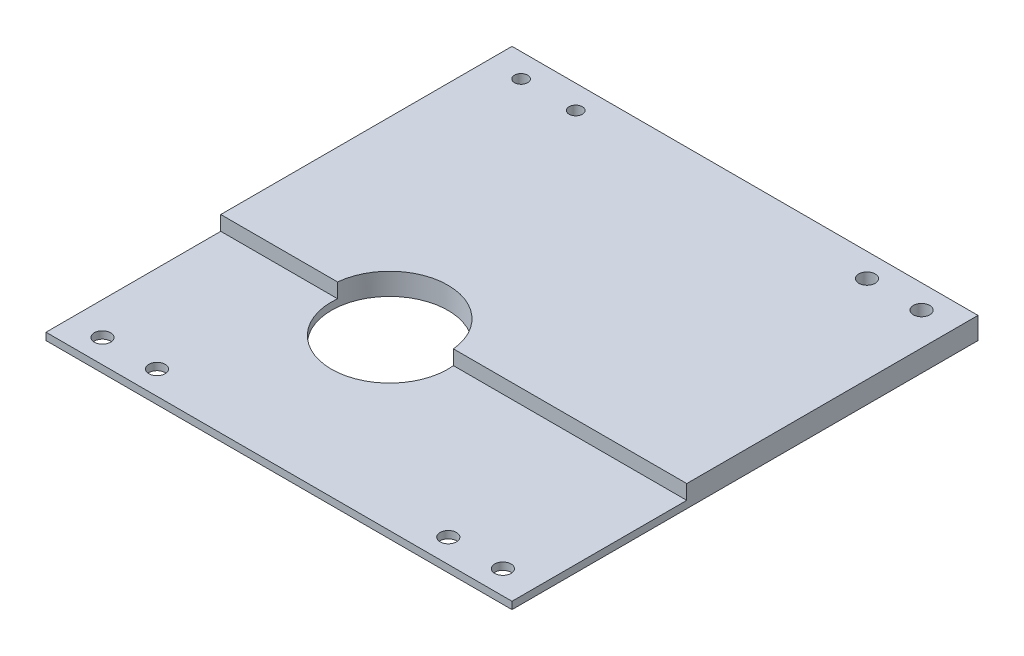
ISO-10303-21;
HEADER;
FILE_DESCRIPTION(('STEP AP214'),'2;1');
FILE_NAME('part.step','',(''),(''),'','','');
FILE_SCHEMA(('AUTOMOTIVE_DESIGN { 1 0 10303 214 1 1 1 1 }'));
ENDSEC;
DATA;
#1=APPLICATION_CONTEXT('core data for automotive mechanical design processes');
#2=APPLICATION_PROTOCOL_DEFINITION('international standard','automotive_design',2000,#1);
#3=PRODUCT_CONTEXT('',#1,'mechanical');
#4=PRODUCT('Part','Part','',(#3));
#5=PRODUCT_RELATED_PRODUCT_CATEGORY('part','',(#4));
#6=PRODUCT_DEFINITION_FORMATION('','',#4);
#7=PRODUCT_DEFINITION_CONTEXT('part definition',#1,'design');
#8=PRODUCT_DEFINITION('design','',#6,#7);
#9=PRODUCT_DEFINITION_SHAPE('','',#8);
#10=(LENGTH_UNIT() NAMED_UNIT(*) SI_UNIT(.MILLI.,.METRE.));
#11=(NAMED_UNIT(*) PLANE_ANGLE_UNIT() SI_UNIT($,.RADIAN.));
#12=(NAMED_UNIT(*) SI_UNIT($,.STERADIAN.) SOLID_ANGLE_UNIT());
#13=UNCERTAINTY_MEASURE_WITH_UNIT(LENGTH_MEASURE(1.E-05),#10,'distance_accuracy_value','');
#14=(GEOMETRIC_REPRESENTATION_CONTEXT(3) GLOBAL_UNCERTAINTY_ASSIGNED_CONTEXT((#13)) GLOBAL_UNIT_ASSIGNED_CONTEXT((#10,
#11,#12)) REPRESENTATION_CONTEXT('',''));
#15=CARTESIAN_POINT('',(0.,0.,0.));
#16=DIRECTION('',(0.,0.,1.));
#17=DIRECTION('',(1.,0.,0.));
#18=AXIS2_PLACEMENT_3D('',#15,#16,#17);
#19=CARTESIAN_POINT('',(-203.2,19.05,50.8));
#20=DIRECTION('',(0.,0.,-1.));
#21=DIRECTION('',(-1.,0.,0.));
#22=AXIS2_PLACEMENT_3D('',#19,#20,#21);
#23=PLANE('',#22);
#24=DIRECTION('',(1.,0.,0.));
#25=VECTOR('',#24,1.);
#26=CARTESIAN_POINT('',(-203.2,19.05,50.8));
#27=LINE('',#26,#25);
#28=CARTESIAN_POINT('',(-0.25463819498369,19.05,50.8));
#29=VERTEX_POINT('',#28);
#30=CARTESIAN_POINT('',(203.2,19.05,50.8));
#31=VERTEX_POINT('',#30);
#32=EDGE_CURVE('E107',#29,#31,#27,.T.);
#33=ORIENTED_EDGE('',*,*,#32,.F.);
#34=DIRECTION('',(0.,-1.,0.));
#35=VECTOR('',#34,1.);
#36=CARTESIAN_POINT('',(-0.25463819498369,19.050025,50.8));
#37=LINE('',#36,#35);
#38=CARTESIAN_POINT('',(-0.25463819498369,6.35,50.8));
#39=VERTEX_POINT('',#38);
#40=EDGE_CURVE('E103',#29,#39,#37,.T.);
#41=ORIENTED_EDGE('',*,*,#40,.T.);
#42=DIRECTION('',(1.,0.,0.));
#43=VECTOR('',#42,1.);
#44=CARTESIAN_POINT('',(-203.2,6.35,50.8));
#45=LINE('',#44,#43);
#46=CARTESIAN_POINT('',(203.2,6.35,50.8));
#47=VERTEX_POINT('',#46);
#48=EDGE_CURVE('E11',#39,#47,#45,.T.);
#49=ORIENTED_EDGE('',*,*,#48,.T.);
#50=DIRECTION('',(0.,-1.,0.));
#51=VECTOR('',#50,1.);
#52=CARTESIAN_POINT('',(203.2,19.05,50.8));
#53=LINE('',#52,#51);
#54=EDGE_CURVE('E123',#31,#47,#53,.T.);
#55=ORIENTED_EDGE('',*,*,#54,.F.);
#56=EDGE_LOOP('',(#33,#41,#49,#55));
#57=FACE_BOUND('',#56,.T.);
#58=ADVANCED_FACE('F36',(#57),#23,.F.);
#59=CARTESIAN_POINT('',(-203.2,6.35,-203.2));
#60=DIRECTION('',(1.,0.,0.));
#61=DIRECTION('',(0.,0.,-1.));
#62=AXIS2_PLACEMENT_3D('',#59,#60,#61);
#63=PLANE('',#62);
#64=DIRECTION('',(0.,0.,1.));
#65=VECTOR('',#64,1.);
#66=CARTESIAN_POINT('',(-203.2,0.,-203.2));
#67=LINE('',#66,#65);
#68=CARTESIAN_POINT('',(-203.2,0.,-203.2));
#69=VERTEX_POINT('',#68);
#70=CARTESIAN_POINT('',(-203.2,0.,203.2));
#71=VERTEX_POINT('',#70);
#72=EDGE_CURVE('E120',#69,#71,#67,.T.);
#73=ORIENTED_EDGE('',*,*,#72,.T.);
#74=DIRECTION('',(0.,-1.,0.));
#75=VECTOR('',#74,1.);
#76=CARTESIAN_POINT('',(-203.2,6.35,203.2));
#77=LINE('',#76,#75);
#78=CARTESIAN_POINT('',(-203.2,6.35,203.2));
#79=VERTEX_POINT('',#78);
#80=EDGE_CURVE('E45',#79,#71,#77,.T.);
#81=ORIENTED_EDGE('',*,*,#80,.F.);
#82=DIRECTION('',(0.,0.,1.));
#83=VECTOR('',#82,1.);
#84=CARTESIAN_POINT('',(-203.2,6.35,-203.2));
#85=LINE('',#84,#83);
#86=CARTESIAN_POINT('',(-203.2,6.35,50.8));
#87=VERTEX_POINT('',#86);
#88=EDGE_CURVE('E131',#87,#79,#85,.T.);
#89=ORIENTED_EDGE('',*,*,#88,.F.);
#90=DIRECTION('',(0.,-1.,0.));
#91=VECTOR('',#90,1.);
#92=CARTESIAN_POINT('',(-203.2,19.05,50.8));
#93=LINE('',#92,#91);
#94=CARTESIAN_POINT('',(-203.2,19.05,50.8));
#95=VERTEX_POINT('',#94);
#96=EDGE_CURVE('E117',#95,#87,#93,.T.);
#97=ORIENTED_EDGE('',*,*,#96,.F.);
#98=DIRECTION('',(0.,0.,1.));
#99=VECTOR('',#98,1.);
#100=CARTESIAN_POINT('',(-203.2,19.05,-203.2));
#101=LINE('',#100,#99);
#102=CARTESIAN_POINT('',(-203.2,19.05,-203.2));
#103=VERTEX_POINT('',#102);
#104=EDGE_CURVE('E186',#103,#95,#101,.T.);
#105=ORIENTED_EDGE('',*,*,#104,.F.);
#106=DIRECTION('',(0.,-1.,0.));
#107=VECTOR('',#106,1.);
#108=CARTESIAN_POINT('',(-203.2,6.35,-203.2));
#109=LINE('',#108,#107);
#110=EDGE_CURVE('E136',#103,#69,#109,.T.);
#111=ORIENTED_EDGE('',*,*,#110,.T.);
#112=EDGE_LOOP('',(#73,#81,#89,#97,#105,#111));
#113=FACE_BOUND('',#112,.T.);
#114=ADVANCED_FACE('F38',(#113),#63,.F.);
#115=CARTESIAN_POINT('',(-203.2,6.35,203.2));
#116=DIRECTION('',(0.,0.,-1.));
#117=DIRECTION('',(-1.,0.,0.));
#118=AXIS2_PLACEMENT_3D('',#115,#116,#117);
#119=PLANE('',#118);
#120=DIRECTION('',(1.,0.,0.));
#121=VECTOR('',#120,1.);
#122=CARTESIAN_POINT('',(-203.2,0.,203.2));
#123=LINE('',#122,#121);
#124=CARTESIAN_POINT('',(203.2,0.,203.2));
#125=VERTEX_POINT('',#124);
#126=EDGE_CURVE('E142',#71,#125,#123,.T.);
#127=ORIENTED_EDGE('',*,*,#126,.T.);
#128=DIRECTION('',(0.,-1.,0.));
#129=VECTOR('',#128,1.);
#130=CARTESIAN_POINT('',(203.2,6.35,203.2));
#131=LINE('',#130,#129);
#132=CARTESIAN_POINT('',(203.2,6.35,203.2));
#133=VERTEX_POINT('',#132);
#134=EDGE_CURVE('E151',#133,#125,#131,.T.);
#135=ORIENTED_EDGE('',*,*,#134,.F.);
#136=DIRECTION('',(1.,0.,0.));
#137=VECTOR('',#136,1.);
#138=CARTESIAN_POINT('',(-203.2,6.35,203.2));
#139=LINE('',#138,#137);
#140=EDGE_CURVE('E128',#79,#133,#139,.T.);
#141=ORIENTED_EDGE('',*,*,#140,.F.);
#142=ORIENTED_EDGE('',*,*,#80,.T.);
#143=EDGE_LOOP('',(#127,#135,#141,#142));
#144=FACE_BOUND('',#143,.T.);
#145=ADVANCED_FACE('F160',(#144),#119,.F.);
#146=CARTESIAN_POINT('',(203.2,6.35,-203.2));
#147=DIRECTION('',(-1.,0.,0.));
#148=DIRECTION('',(0.,0.,1.));
#149=AXIS2_PLACEMENT_3D('',#146,#147,#148);
#150=PLANE('',#149);
#151=DIRECTION('',(0.,0.,-1.));
#152=VECTOR('',#151,1.);
#153=CARTESIAN_POINT('',(203.2,0.,-203.2));
#154=LINE('',#153,#152);
#155=CARTESIAN_POINT('',(203.2,0.,-203.2));
#156=VERTEX_POINT('',#155);
#157=EDGE_CURVE('E144',#125,#156,#154,.T.);
#158=ORIENTED_EDGE('',*,*,#157,.T.);
#159=DIRECTION('',(0.,-1.,0.));
#160=VECTOR('',#159,1.);
#161=CARTESIAN_POINT('',(203.2,6.35,-203.2));
#162=LINE('',#161,#160);
#163=CARTESIAN_POINT('',(203.2,19.05,-203.2));
#164=VERTEX_POINT('',#163);
#165=EDGE_CURVE('E149',#164,#156,#162,.T.);
#166=ORIENTED_EDGE('',*,*,#165,.F.);
#167=DIRECTION('',(0.,0.,-1.));
#168=VECTOR('',#167,1.);
#169=CARTESIAN_POINT('',(203.2,19.05,-203.2));
#170=LINE('',#169,#168);
#171=EDGE_CURVE('E177',#31,#164,#170,.T.);
#172=ORIENTED_EDGE('',*,*,#171,.F.);
#173=ORIENTED_EDGE('',*,*,#54,.T.);
#174=DIRECTION('',(0.,0.,-1.));
#175=VECTOR('',#174,1.);
#176=CARTESIAN_POINT('',(203.2,6.35,-203.2));
#177=LINE('',#176,#175);
#178=EDGE_CURVE('E114',#133,#47,#177,.T.);
#179=ORIENTED_EDGE('',*,*,#178,.F.);
#180=ORIENTED_EDGE('',*,*,#134,.T.);
#181=EDGE_LOOP('',(#158,#166,#172,#173,#179,#180));
#182=FACE_BOUND('',#181,.T.);
#183=ADVANCED_FACE('F167',(#182),#150,.F.);
#184=CARTESIAN_POINT('',(-203.2,6.35,-203.2));
#185=DIRECTION('',(0.,0.,1.));
#186=DIRECTION('',(1.,0.,0.));
#187=AXIS2_PLACEMENT_3D('',#184,#185,#186);
#188=PLANE('',#187);
#189=DIRECTION('',(-1.,0.,0.));
#190=VECTOR('',#189,1.);
#191=CARTESIAN_POINT('',(-203.2,0.,-203.2));
#192=LINE('',#191,#190);
#193=EDGE_CURVE('E134',#156,#69,#192,.T.);
#194=ORIENTED_EDGE('',*,*,#193,.T.);
#195=ORIENTED_EDGE('',*,*,#110,.F.);
#196=DIRECTION('',(-1.,0.,0.));
#197=VECTOR('',#196,1.);
#198=CARTESIAN_POINT('',(-203.2,19.05,-203.2));
#199=LINE('',#198,#197);
#200=EDGE_CURVE('E174',#164,#103,#199,.T.);
#201=ORIENTED_EDGE('',*,*,#200,.F.);
#202=ORIENTED_EDGE('',*,*,#165,.T.);
#203=EDGE_LOOP('',(#194,#195,#201,#202));
#204=FACE_BOUND('',#203,.T.);
#205=ADVANCED_FACE('F172',(#204),#188,.F.);
#206=CARTESIAN_POINT('',(0.,6.35,0.));
#207=DIRECTION('',(0.,1.,0.));
#208=DIRECTION('',(0.,0.,1.));
#209=AXIS2_PLACEMENT_3D('',#206,#207,#208);
#210=PLANE('',#209);
#211=CARTESIAN_POINT('',(-127.,6.35,182.5625));
#212=DIRECTION('',(0.,1.,0.));
#213=DIRECTION('',(0.,0.,1.));
#214=AXIS2_PLACEMENT_3D('',#211,#212,#213);
#215=CIRCLE('',#214,7.14375);
#216=CARTESIAN_POINT('',(-127.,6.35,189.70625));
#217=VERTEX_POINT('',#216);
#218=EDGE_CURVE('E382',#217,#217,#215,.T.);
#219=ORIENTED_EDGE('',*,*,#218,.F.);
#220=EDGE_LOOP('',(#219));
#221=FACE_BOUND('',#220,.T.);
#222=CARTESIAN_POINT('',(-174.625,6.35,182.5625));
#223=DIRECTION('',(0.,1.,0.));
#224=DIRECTION('',(0.,0.,1.));
#225=AXIS2_PLACEMENT_3D('',#222,#223,#224);
#226=CIRCLE('',#225,7.14375000000001);
#227=CARTESIAN_POINT('',(-174.625,6.35,189.70625));
#228=VERTEX_POINT('',#227);
#229=EDGE_CURVE('E386',#228,#228,#226,.T.);
#230=ORIENTED_EDGE('',*,*,#229,.F.);
#231=EDGE_LOOP('',(#230));
#232=FACE_BOUND('',#231,.T.);
#233=CARTESIAN_POINT('',(127.,6.35,182.5625));
#234=DIRECTION('',(0.,1.,0.));
#235=DIRECTION('',(0.,0.,1.));
#236=AXIS2_PLACEMENT_3D('',#233,#234,#235);
#237=CIRCLE('',#236,7.14375000000001);
#238=CARTESIAN_POINT('',(127.,6.35,189.70625));
#239=VERTEX_POINT('',#238);
#240=EDGE_CURVE('E392',#239,#239,#237,.T.);
#241=ORIENTED_EDGE('',*,*,#240,.F.);
#242=EDGE_LOOP('',(#241));
#243=FACE_BOUND('',#242,.T.);
#244=CARTESIAN_POINT('',(174.625,6.35,182.5625));
#245=DIRECTION('',(0.,1.,0.));
#246=DIRECTION('',(0.,0.,1.));
#247=AXIS2_PLACEMENT_3D('',#244,#245,#246);
#248=CIRCLE('',#247,7.14375000000001);
#249=CARTESIAN_POINT('',(174.625,6.35,189.70625));
#250=VERTEX_POINT('',#249);
#251=EDGE_CURVE('E398',#250,#250,#248,.T.);
#252=ORIENTED_EDGE('',*,*,#251,.F.);
#253=EDGE_LOOP('',(#252));
#254=FACE_BOUND('',#253,.T.);
#255=CARTESIAN_POINT('',(-101.345361805016,6.35,50.8));
#256=VERTEX_POINT('',#255);
#257=EDGE_CURVE('E53',#87,#256,#45,.T.);
#258=ORIENTED_EDGE('',*,*,#257,.F.);
#259=ORIENTED_EDGE('',*,*,#88,.T.);
#260=ORIENTED_EDGE('',*,*,#140,.T.);
#261=ORIENTED_EDGE('',*,*,#178,.T.);
#262=ORIENTED_EDGE('',*,*,#48,.F.);
#263=CARTESIAN_POINT('',(-50.8,6.35,55.88));
#264=DIRECTION('',(0.,1.,0.));
#265=DIRECTION('',(0.,0.,1.));
#266=AXIS2_PLACEMENT_3D('',#263,#264,#265);
#267=CIRCLE('',#266,50.8);
#268=EDGE_CURVE('E112',#256,#39,#267,.T.);
#269=ORIENTED_EDGE('',*,*,#268,.F.);
#270=EDGE_LOOP('',(#258,#259,#260,#261,#262,#269));
#271=FACE_BOUND('',#270,.T.);
#272=ADVANCED_FACE('F111',(#221,#232,#243,#254,#271),#210,.T.);
#273=CARTESIAN_POINT('',(0.,0.,0.));
#274=DIRECTION('',(0.,1.,0.));
#275=DIRECTION('',(0.,0.,1.));
#276=AXIS2_PLACEMENT_3D('',#273,#274,#275);
#277=PLANE('',#276);
#278=CARTESIAN_POINT('',(127.,0.,-182.5625));
#279=DIRECTION('',(0.,1.,0.));
#280=DIRECTION('',(0.,0.,1.));
#281=AXIS2_PLACEMENT_3D('',#278,#279,#280);
#282=CIRCLE('',#281,7.14375000000001);
#283=CARTESIAN_POINT('',(127.,0.,-175.41875));
#284=VERTEX_POINT('',#283);
#285=EDGE_CURVE('E358',#284,#284,#282,.T.);
#286=ORIENTED_EDGE('',*,*,#285,.T.);
#287=EDGE_LOOP('',(#286));
#288=FACE_BOUND('',#287,.T.);
#289=CARTESIAN_POINT('',(174.625,0.,-182.5625));
#290=DIRECTION('',(0.,1.,0.));
#291=DIRECTION('',(0.,0.,1.));
#292=AXIS2_PLACEMENT_3D('',#289,#290,#291);
#293=CIRCLE('',#292,7.14375000000001);
#294=CARTESIAN_POINT('',(174.625,0.,-175.41875));
#295=VERTEX_POINT('',#294);
#296=EDGE_CURVE('E365',#295,#295,#293,.T.);
#297=ORIENTED_EDGE('',*,*,#296,.T.);
#298=EDGE_LOOP('',(#297));
#299=FACE_BOUND('',#298,.T.);
#300=CARTESIAN_POINT('',(-174.625,0.,-182.5625));
#301=DIRECTION('',(0.,1.,0.));
#302=DIRECTION('',(0.,0.,1.));
#303=AXIS2_PLACEMENT_3D('',#300,#301,#302);
#304=CIRCLE('',#303,5.75436999999998);
#305=CARTESIAN_POINT('',(-174.625,0.,-176.80813));
#306=VERTEX_POINT('',#305);
#307=EDGE_CURVE('E373',#306,#306,#304,.T.);
#308=ORIENTED_EDGE('',*,*,#307,.T.);
#309=EDGE_LOOP('',(#308));
#310=FACE_BOUND('',#309,.T.);
#311=CARTESIAN_POINT('',(-127.,0.,-182.5625));
#312=DIRECTION('',(0.,1.,0.));
#313=DIRECTION('',(0.,0.,1.));
#314=AXIS2_PLACEMENT_3D('',#311,#312,#313);
#315=CIRCLE('',#314,5.75436999999999);
#316=CARTESIAN_POINT('',(-127.,0.,-176.80813));
#317=VERTEX_POINT('',#316);
#318=EDGE_CURVE('E379',#317,#317,#315,.T.);
#319=ORIENTED_EDGE('',*,*,#318,.T.);
#320=EDGE_LOOP('',(#319));
#321=FACE_BOUND('',#320,.T.);
#322=CARTESIAN_POINT('',(-127.,0.,182.5625));
#323=DIRECTION('',(0.,1.,0.));
#324=DIRECTION('',(0.,0.,1.));
#325=AXIS2_PLACEMENT_3D('',#322,#323,#324);
#326=CIRCLE('',#325,7.14375);
#327=CARTESIAN_POINT('',(-127.,0.,189.70625));
#328=VERTEX_POINT('',#327);
#329=EDGE_CURVE('E383',#328,#328,#326,.T.);
#330=ORIENTED_EDGE('',*,*,#329,.T.);
#331=EDGE_LOOP('',(#330));
#332=FACE_BOUND('',#331,.T.);
#333=CARTESIAN_POINT('',(-174.625,0.,182.5625));
#334=DIRECTION('',(0.,1.,0.));
#335=DIRECTION('',(0.,0.,1.));
#336=AXIS2_PLACEMENT_3D('',#333,#334,#335);
#337=CIRCLE('',#336,7.14375000000001);
#338=CARTESIAN_POINT('',(-174.625,0.,189.70625));
#339=VERTEX_POINT('',#338);
#340=EDGE_CURVE('E389',#339,#339,#337,.T.);
#341=ORIENTED_EDGE('',*,*,#340,.T.);
#342=EDGE_LOOP('',(#341));
#343=FACE_BOUND('',#342,.T.);
#344=CARTESIAN_POINT('',(127.,0.,182.5625));
#345=DIRECTION('',(0.,1.,0.));
#346=DIRECTION('',(0.,0.,1.));
#347=AXIS2_PLACEMENT_3D('',#344,#345,#346);
#348=CIRCLE('',#347,7.14375000000001);
#349=CARTESIAN_POINT('',(127.,0.,189.70625));
#350=VERTEX_POINT('',#349);
#351=EDGE_CURVE('E395',#350,#350,#348,.T.);
#352=ORIENTED_EDGE('',*,*,#351,.T.);
#353=EDGE_LOOP('',(#352));
#354=FACE_BOUND('',#353,.T.);
#355=CARTESIAN_POINT('',(174.625,0.,182.5625));
#356=DIRECTION('',(0.,1.,0.));
#357=DIRECTION('',(0.,0.,1.));
#358=AXIS2_PLACEMENT_3D('',#355,#356,#357);
#359=CIRCLE('',#358,7.14375000000001);
#360=CARTESIAN_POINT('',(174.625,0.,189.70625));
#361=VERTEX_POINT('',#360);
#362=EDGE_CURVE('E401',#361,#361,#359,.T.);
#363=ORIENTED_EDGE('',*,*,#362,.T.);
#364=EDGE_LOOP('',(#363));
#365=FACE_BOUND('',#364,.T.);
#366=CARTESIAN_POINT('',(-50.8,0.,55.88));
#367=DIRECTION('',(0.,1.,0.));
#368=DIRECTION('',(0.,0.,1.));
#369=AXIS2_PLACEMENT_3D('',#366,#367,#368);
#370=CIRCLE('',#369,50.8);
#371=CARTESIAN_POINT('',(-50.8,0.,106.68));
#372=VERTEX_POINT('',#371);
#373=EDGE_CURVE('E116',#372,#372,#370,.T.);
#374=ORIENTED_EDGE('',*,*,#373,.T.);
#375=EDGE_LOOP('',(#374));
#376=FACE_BOUND('',#375,.T.);
#377=ORIENTED_EDGE('',*,*,#72,.F.);
#378=ORIENTED_EDGE('',*,*,#193,.F.);
#379=ORIENTED_EDGE('',*,*,#157,.F.);
#380=ORIENTED_EDGE('',*,*,#126,.F.);
#381=EDGE_LOOP('',(#377,#378,#379,#380));
#382=FACE_BOUND('',#381,.T.);
#383=ADVANCED_FACE('F166',(#288,#299,#310,#321,#332,#343,#354,#365,#376,#382),#277,.F.);
#384=CARTESIAN_POINT('',(-50.8,0.,55.88));
#385=DIRECTION('',(0.,1.,0.));
#386=DIRECTION('',(0.,0.,1.));
#387=AXIS2_PLACEMENT_3D('',#384,#385,#386);
#388=CYLINDRICAL_SURFACE('',#387,50.8);
#389=ORIENTED_EDGE('',*,*,#373,.F.);
#390=EDGE_LOOP('',(#389));
#391=FACE_BOUND('',#390,.T.);
#392=ORIENTED_EDGE('',*,*,#268,.T.);
#393=ORIENTED_EDGE('',*,*,#40,.F.);
#394=CARTESIAN_POINT('',(-50.8,19.05,55.88));
#395=DIRECTION('',(0.,1.,0.));
#396=DIRECTION('',(0.,0.,1.));
#397=AXIS2_PLACEMENT_3D('',#394,#395,#396);
#398=CIRCLE('',#397,50.8);
#399=CARTESIAN_POINT('',(-101.345361805016,19.05,50.8));
#400=VERTEX_POINT('',#399);
#401=EDGE_CURVE('E109',#29,#400,#398,.T.);
#402=ORIENTED_EDGE('',*,*,#401,.T.);
#403=DIRECTION('',(0.,-1.,0.));
#404=VECTOR('',#403,1.);
#405=CARTESIAN_POINT('',(-101.345361805016,19.050025,50.8));
#406=LINE('',#405,#404);
#407=EDGE_CURVE('E61',#256,#400,#406,.F.);
#408=ORIENTED_EDGE('',*,*,#407,.F.);
#409=EDGE_LOOP('',(#392,#393,#402,#408));
#410=FACE_BOUND('',#409,.T.);
#411=ADVANCED_FACE('F115',(#391,#410),#388,.F.);
#412=ORIENTED_EDGE('',*,*,#257,.T.);
#413=ORIENTED_EDGE('',*,*,#407,.T.);
#414=EDGE_CURVE('E179',#95,#400,#27,.T.);
#415=ORIENTED_EDGE('',*,*,#414,.F.);
#416=ORIENTED_EDGE('',*,*,#96,.T.);
#417=EDGE_LOOP('',(#412,#413,#415,#416));
#418=FACE_BOUND('',#417,.T.);
#419=ADVANCED_FACE('F196',(#418),#23,.F.);
#420=CARTESIAN_POINT('',(0.,19.05,0.));
#421=DIRECTION('',(0.,1.,0.));
#422=DIRECTION('',(0.,0.,1.));
#423=AXIS2_PLACEMENT_3D('',#420,#421,#422);
#424=PLANE('',#423);
#425=CARTESIAN_POINT('',(127.,19.05,-182.5625));
#426=DIRECTION('',(0.,1.,0.));
#427=DIRECTION('',(0.,0.,1.));
#428=AXIS2_PLACEMENT_3D('',#425,#426,#427);
#429=CIRCLE('',#428,7.14375000000001);
#430=CARTESIAN_POINT('',(127.,19.05,-175.41875));
#431=VERTEX_POINT('',#430);
#432=EDGE_CURVE('E360',#431,#431,#429,.T.);
#433=ORIENTED_EDGE('',*,*,#432,.F.);
#434=EDGE_LOOP('',(#433));
#435=FACE_BOUND('',#434,.T.);
#436=CARTESIAN_POINT('',(174.625,19.05,-182.5625));
#437=DIRECTION('',(0.,1.,0.));
#438=DIRECTION('',(0.,0.,1.));
#439=AXIS2_PLACEMENT_3D('',#436,#437,#438);
#440=CIRCLE('',#439,7.14375000000001);
#441=CARTESIAN_POINT('',(174.625,19.05,-175.41875));
#442=VERTEX_POINT('',#441);
#443=EDGE_CURVE('E362',#442,#442,#440,.T.);
#444=ORIENTED_EDGE('',*,*,#443,.F.);
#445=EDGE_LOOP('',(#444));
#446=FACE_BOUND('',#445,.T.);
#447=CARTESIAN_POINT('',(-174.625,19.05,-182.5625));
#448=DIRECTION('',(0.,1.,0.));
#449=DIRECTION('',(0.,0.,1.));
#450=AXIS2_PLACEMENT_3D('',#447,#448,#449);
#451=CIRCLE('',#450,5.75436999999998);
#452=CARTESIAN_POINT('',(-174.625,19.05,-176.80813));
#453=VERTEX_POINT('',#452);
#454=EDGE_CURVE('E368',#453,#453,#451,.T.);
#455=ORIENTED_EDGE('',*,*,#454,.F.);
#456=EDGE_LOOP('',(#455));
#457=FACE_BOUND('',#456,.T.);
#458=CARTESIAN_POINT('',(-127.,19.05,-182.5625));
#459=DIRECTION('',(0.,1.,0.));
#460=DIRECTION('',(0.,0.,1.));
#461=AXIS2_PLACEMENT_3D('',#458,#459,#460);
#462=CIRCLE('',#461,5.75436999999998);
#463=CARTESIAN_POINT('',(-127.,19.05,-176.80813));
#464=VERTEX_POINT('',#463);
#465=EDGE_CURVE('E376',#464,#464,#462,.T.);
#466=ORIENTED_EDGE('',*,*,#465,.F.);
#467=EDGE_LOOP('',(#466));
#468=FACE_BOUND('',#467,.T.);
#469=ORIENTED_EDGE('',*,*,#401,.F.);
#470=ORIENTED_EDGE('',*,*,#32,.T.);
#471=ORIENTED_EDGE('',*,*,#171,.T.);
#472=ORIENTED_EDGE('',*,*,#200,.T.);
#473=ORIENTED_EDGE('',*,*,#104,.T.);
#474=ORIENTED_EDGE('',*,*,#414,.T.);
#475=EDGE_LOOP('',(#469,#470,#471,#472,#473,#474));
#476=FACE_BOUND('',#475,.T.);
#477=ADVANCED_FACE('F193',(#435,#446,#457,#468,#476),#424,.T.);
#478=CARTESIAN_POINT('',(174.625,0.,182.5625));
#479=DIRECTION('',(0.,1.,0.));
#480=DIRECTION('',(0.,0.,1.));
#481=AXIS2_PLACEMENT_3D('',#478,#479,#480);
#482=CYLINDRICAL_SURFACE('',#481,7.14375000000001);
#483=ORIENTED_EDGE('',*,*,#362,.F.);
#484=EDGE_LOOP('',(#483));
#485=FACE_BOUND('',#484,.T.);
#486=ORIENTED_EDGE('',*,*,#251,.T.);
#487=EDGE_LOOP('',(#486));
#488=FACE_BOUND('',#487,.T.);
#489=ADVANCED_FACE('F195',(#485,#488),#482,.F.);
#490=CARTESIAN_POINT('',(127.,0.,182.5625));
#491=DIRECTION('',(0.,1.,0.));
#492=DIRECTION('',(0.,0.,1.));
#493=AXIS2_PLACEMENT_3D('',#490,#491,#492);
#494=CYLINDRICAL_SURFACE('',#493,7.14375000000001);
#495=ORIENTED_EDGE('',*,*,#351,.F.);
#496=EDGE_LOOP('',(#495));
#497=FACE_BOUND('',#496,.T.);
#498=ORIENTED_EDGE('',*,*,#240,.T.);
#499=EDGE_LOOP('',(#498));
#500=FACE_BOUND('',#499,.T.);
#501=ADVANCED_FACE('F203',(#497,#500),#494,.F.);
#502=CARTESIAN_POINT('',(-174.625,0.,182.5625));
#503=DIRECTION('',(0.,1.,0.));
#504=DIRECTION('',(0.,0.,1.));
#505=AXIS2_PLACEMENT_3D('',#502,#503,#504);
#506=CYLINDRICAL_SURFACE('',#505,7.14375000000001);
#507=ORIENTED_EDGE('',*,*,#340,.F.);
#508=EDGE_LOOP('',(#507));
#509=FACE_BOUND('',#508,.T.);
#510=ORIENTED_EDGE('',*,*,#229,.T.);
#511=EDGE_LOOP('',(#510));
#512=FACE_BOUND('',#511,.T.);
#513=ADVANCED_FACE('F289',(#509,#512),#506,.F.);
#514=CARTESIAN_POINT('',(-127.,0.,182.5625));
#515=DIRECTION('',(0.,1.,0.));
#516=DIRECTION('',(0.,0.,1.));
#517=AXIS2_PLACEMENT_3D('',#514,#515,#516);
#518=CYLINDRICAL_SURFACE('',#517,7.14375);
#519=ORIENTED_EDGE('',*,*,#329,.F.);
#520=EDGE_LOOP('',(#519));
#521=FACE_BOUND('',#520,.T.);
#522=ORIENTED_EDGE('',*,*,#218,.T.);
#523=EDGE_LOOP('',(#522));
#524=FACE_BOUND('',#523,.T.);
#525=ADVANCED_FACE('F298',(#521,#524),#518,.F.);
#526=CARTESIAN_POINT('',(-127.,19.05,-182.5625));
#527=DIRECTION('',(0.,1.,0.));
#528=DIRECTION('',(0.,0.,1.));
#529=AXIS2_PLACEMENT_3D('',#526,#527,#528);
#530=CYLINDRICAL_SURFACE('',#529,5.75436999999999);
#531=ORIENTED_EDGE('',*,*,#318,.F.);
#532=EDGE_LOOP('',(#531));
#533=FACE_BOUND('',#532,.T.);
#534=ORIENTED_EDGE('',*,*,#465,.T.);
#535=EDGE_LOOP('',(#534));
#536=FACE_BOUND('',#535,.T.);
#537=ADVANCED_FACE('F307',(#533,#536),#530,.F.);
#538=CARTESIAN_POINT('',(-174.625,19.05,-182.5625));
#539=DIRECTION('',(0.,1.,0.));
#540=DIRECTION('',(0.,0.,1.));
#541=AXIS2_PLACEMENT_3D('',#538,#539,#540);
#542=CYLINDRICAL_SURFACE('',#541,5.75436999999998);
#543=ORIENTED_EDGE('',*,*,#307,.F.);
#544=EDGE_LOOP('',(#543));
#545=FACE_BOUND('',#544,.T.);
#546=ORIENTED_EDGE('',*,*,#454,.T.);
#547=EDGE_LOOP('',(#546));
#548=FACE_BOUND('',#547,.T.);
#549=ADVANCED_FACE('F316',(#545,#548),#542,.F.);
#550=CARTESIAN_POINT('',(174.625,0.,-182.5625));
#551=DIRECTION('',(0.,1.,0.));
#552=DIRECTION('',(0.,0.,1.));
#553=AXIS2_PLACEMENT_3D('',#550,#551,#552);
#554=CYLINDRICAL_SURFACE('',#553,7.14375000000001);
#555=ORIENTED_EDGE('',*,*,#296,.F.);
#556=EDGE_LOOP('',(#555));
#557=FACE_BOUND('',#556,.T.);
#558=ORIENTED_EDGE('',*,*,#443,.T.);
#559=EDGE_LOOP('',(#558));
#560=FACE_BOUND('',#559,.T.);
#561=ADVANCED_FACE('F325',(#557,#560),#554,.F.);
#562=CARTESIAN_POINT('',(127.,0.,-182.5625));
#563=DIRECTION('',(0.,1.,0.));
#564=DIRECTION('',(0.,0.,1.));
#565=AXIS2_PLACEMENT_3D('',#562,#563,#564);
#566=CYLINDRICAL_SURFACE('',#565,7.14375000000001);
#567=ORIENTED_EDGE('',*,*,#285,.F.);
#568=EDGE_LOOP('',(#567));
#569=FACE_BOUND('',#568,.T.);
#570=ORIENTED_EDGE('',*,*,#432,.T.);
#571=EDGE_LOOP('',(#570));
#572=FACE_BOUND('',#571,.T.);
#573=ADVANCED_FACE('F334',(#569,#572),#566,.F.);
#574=CLOSED_SHELL('',(#58,#114,#145,#183,#205,#272,#383,#411,#419,#477,#489,#501,#513,#525,#537,
#549,#561,#573));
#575=MANIFOLD_SOLID_BREP('B2',#574);
#576=ADVANCED_BREP_SHAPE_REPRESENTATION('',(#18,#575),#14);
#577=SHAPE_DEFINITION_REPRESENTATION(#9,#576);
ENDSEC;
END-ISO-10303-21;
